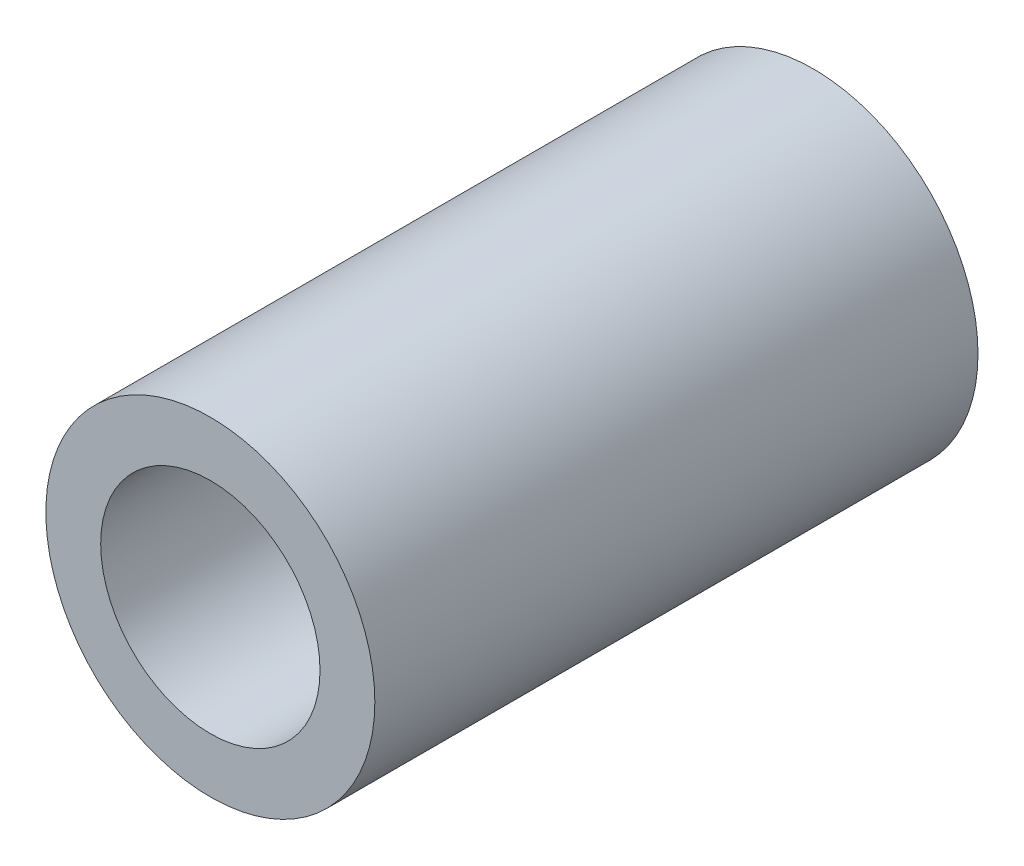
ISO-10303-21;
HEADER;
FILE_DESCRIPTION(('STEP AP214'),'2;1');
FILE_NAME('part.step','',(''),(''),'','','');
FILE_SCHEMA(('AUTOMOTIVE_DESIGN { 1 0 10303 214 1 1 1 1 }'));
ENDSEC;
DATA;
#1=APPLICATION_CONTEXT('core data for automotive mechanical design processes');
#2=APPLICATION_PROTOCOL_DEFINITION('international standard','automotive_design',2000,#1);
#3=PRODUCT_CONTEXT('',#1,'mechanical');
#4=PRODUCT('Part','Part','',(#3));
#5=PRODUCT_RELATED_PRODUCT_CATEGORY('part','',(#4));
#6=PRODUCT_DEFINITION_FORMATION('','',#4);
#7=PRODUCT_DEFINITION_CONTEXT('part definition',#1,'design');
#8=PRODUCT_DEFINITION('design','',#6,#7);
#9=PRODUCT_DEFINITION_SHAPE('','',#8);
#10=(LENGTH_UNIT() NAMED_UNIT(*) SI_UNIT(.MILLI.,.METRE.));
#11=(NAMED_UNIT(*) PLANE_ANGLE_UNIT() SI_UNIT($,.RADIAN.));
#12=(NAMED_UNIT(*) SI_UNIT($,.STERADIAN.) SOLID_ANGLE_UNIT());
#13=UNCERTAINTY_MEASURE_WITH_UNIT(LENGTH_MEASURE(1.E-05),#10,'distance_accuracy_value','');
#14=(GEOMETRIC_REPRESENTATION_CONTEXT(3) GLOBAL_UNCERTAINTY_ASSIGNED_CONTEXT((#13)) GLOBAL_UNIT_ASSIGNED_CONTEXT((#10,
#11,#12)) REPRESENTATION_CONTEXT('',''));
#15=CARTESIAN_POINT('',(0.,0.,0.));
#16=DIRECTION('',(0.,0.,1.));
#17=DIRECTION('',(1.,0.,0.));
#18=AXIS2_PLACEMENT_3D('',#15,#16,#17);
#19=CARTESIAN_POINT('',(0.,0.,5.5));
#20=DIRECTION('',(0.,0.,1.));
#21=DIRECTION('',(1.,0.,0.));
#22=AXIS2_PLACEMENT_3D('',#19,#20,#21);
#23=PLANE('',#22);
#24=CARTESIAN_POINT('',(0.,0.,5.5));
#25=DIRECTION('',(0.,0.,1.));
#26=DIRECTION('',(1.,0.,0.));
#27=AXIS2_PLACEMENT_3D('',#24,#25,#26);
#28=CIRCLE('',#27,1.5);
#29=CARTESIAN_POINT('',(1.5,0.,5.5));
#30=VERTEX_POINT('',#29);
#31=EDGE_CURVE('E10',#30,#30,#28,.T.);
#32=ORIENTED_EDGE('',*,*,#31,.T.);
#33=EDGE_LOOP('',(#32));
#34=FACE_BOUND('',#33,.T.);
#35=CARTESIAN_POINT('',(0.,0.,5.5));
#36=DIRECTION('',(0.,0.,1.));
#37=DIRECTION('',(1.,0.,0.));
#38=AXIS2_PLACEMENT_3D('',#35,#36,#37);
#39=CIRCLE('',#38,1.);
#40=CARTESIAN_POINT('',(1.,0.,5.5));
#41=VERTEX_POINT('',#40);
#42=EDGE_CURVE('E52',#41,#41,#39,.T.);
#43=ORIENTED_EDGE('',*,*,#42,.F.);
#44=EDGE_LOOP('',(#43));
#45=FACE_BOUND('',#44,.T.);
#46=ADVANCED_FACE('F39',(#34,#45),#23,.T.);
#47=CARTESIAN_POINT('',(0.,0.,0.));
#48=DIRECTION('',(0.,0.,1.));
#49=DIRECTION('',(1.,0.,0.));
#50=AXIS2_PLACEMENT_3D('',#47,#48,#49);
#51=PLANE('',#50);
#52=CARTESIAN_POINT('',(0.,0.,0.));
#53=DIRECTION('',(0.,0.,1.));
#54=DIRECTION('',(1.,0.,0.));
#55=AXIS2_PLACEMENT_3D('',#52,#53,#54);
#56=CIRCLE('',#55,1.5);
#57=CARTESIAN_POINT('',(1.5,0.,0.));
#58=VERTEX_POINT('',#57);
#59=EDGE_CURVE('E43',#58,#58,#56,.T.);
#60=ORIENTED_EDGE('',*,*,#59,.F.);
#61=EDGE_LOOP('',(#60));
#62=FACE_BOUND('',#61,.T.);
#63=CARTESIAN_POINT('',(0.,0.,0.));
#64=DIRECTION('',(0.,0.,1.));
#65=DIRECTION('',(1.,0.,0.));
#66=AXIS2_PLACEMENT_3D('',#63,#64,#65);
#67=CIRCLE('',#66,1.);
#68=CARTESIAN_POINT('',(1.,0.,0.));
#69=VERTEX_POINT('',#68);
#70=EDGE_CURVE('E54',#69,#69,#67,.T.);
#71=ORIENTED_EDGE('',*,*,#70,.T.);
#72=EDGE_LOOP('',(#71));
#73=FACE_BOUND('',#72,.T.);
#74=ADVANCED_FACE('F66',(#62,#73),#51,.F.);
#75=CARTESIAN_POINT('',(0.,0.,5.5));
#76=DIRECTION('',(0.,0.,-1.));
#77=DIRECTION('',(-1.,0.,0.));
#78=AXIS2_PLACEMENT_3D('',#75,#76,#77);
#79=CYLINDRICAL_SURFACE('',#78,1.5);
#80=ORIENTED_EDGE('',*,*,#31,.F.);
#81=EDGE_LOOP('',(#80));
#82=FACE_BOUND('',#81,.T.);
#83=ORIENTED_EDGE('',*,*,#59,.T.);
#84=EDGE_LOOP('',(#83));
#85=FACE_BOUND('',#84,.T.);
#86=ADVANCED_FACE('F41',(#82,#85),#79,.T.);
#87=CARTESIAN_POINT('',(0.,0.,5.5));
#88=DIRECTION('',(0.,0.,-1.));
#89=DIRECTION('',(-1.,0.,0.));
#90=AXIS2_PLACEMENT_3D('',#87,#88,#89);
#91=CYLINDRICAL_SURFACE('',#90,1.);
#92=ORIENTED_EDGE('',*,*,#42,.T.);
#93=EDGE_LOOP('',(#92));
#94=FACE_BOUND('',#93,.T.);
#95=ORIENTED_EDGE('',*,*,#70,.F.);
#96=EDGE_LOOP('',(#95));
#97=FACE_BOUND('',#96,.T.);
#98=ADVANCED_FACE('F62',(#94,#97),#91,.F.);
#99=CLOSED_SHELL('',(#46,#74,#86,#98));
#100=MANIFOLD_SOLID_BREP('B2',#99);
#101=ADVANCED_BREP_SHAPE_REPRESENTATION('',(#18,#100),#14);
#102=SHAPE_DEFINITION_REPRESENTATION(#9,#101);
ENDSEC;
END-ISO-10303-21;
